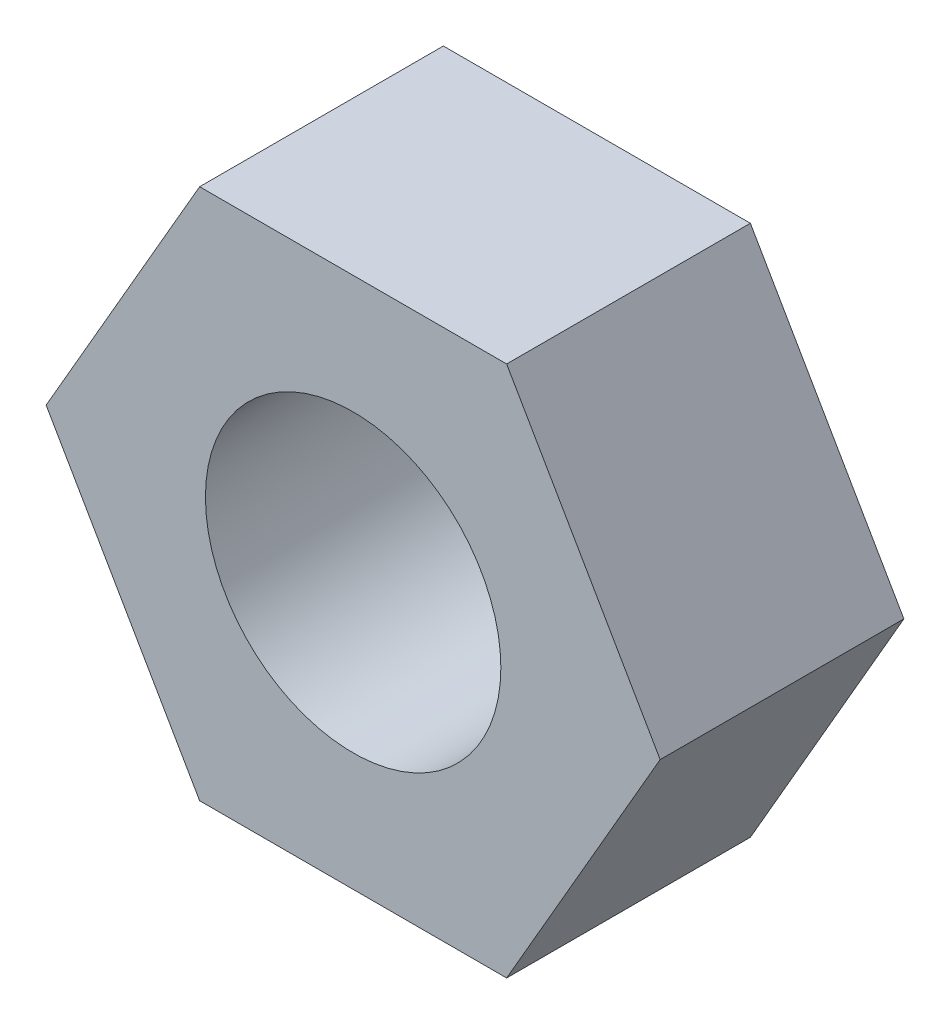
ISO-10303-21;
HEADER;
FILE_DESCRIPTION(('STEP AP214'),'2;1');
FILE_NAME('part.step','',(''),(''),'','','');
FILE_SCHEMA(('AUTOMOTIVE_DESIGN { 1 0 10303 214 1 1 1 1 }'));
ENDSEC;
DATA;
#1=APPLICATION_CONTEXT('core data for automotive mechanical design processes');
#2=APPLICATION_PROTOCOL_DEFINITION('international standard','automotive_design',2000,#1);
#3=PRODUCT_CONTEXT('',#1,'mechanical');
#4=PRODUCT('Part','Part','',(#3));
#5=PRODUCT_RELATED_PRODUCT_CATEGORY('part','',(#4));
#6=PRODUCT_DEFINITION_FORMATION('','',#4);
#7=PRODUCT_DEFINITION_CONTEXT('part definition',#1,'design');
#8=PRODUCT_DEFINITION('design','',#6,#7);
#9=PRODUCT_DEFINITION_SHAPE('','',#8);
#10=(LENGTH_UNIT() NAMED_UNIT(*) SI_UNIT(.MILLI.,.METRE.));
#11=(NAMED_UNIT(*) PLANE_ANGLE_UNIT() SI_UNIT($,.RADIAN.));
#12=(NAMED_UNIT(*) SI_UNIT($,.STERADIAN.) SOLID_ANGLE_UNIT());
#13=UNCERTAINTY_MEASURE_WITH_UNIT(LENGTH_MEASURE(1.E-05),#10,'distance_accuracy_value','');
#14=(GEOMETRIC_REPRESENTATION_CONTEXT(3) GLOBAL_UNCERTAINTY_ASSIGNED_CONTEXT((#13)) GLOBAL_UNIT_ASSIGNED_CONTEXT((#10,
#11,#12)) REPRESENTATION_CONTEXT('',''));
#15=CARTESIAN_POINT('',(0.,0.,0.));
#16=DIRECTION('',(0.,0.,1.));
#17=DIRECTION('',(1.,0.,0.));
#18=AXIS2_PLACEMENT_3D('',#15,#16,#17);
#19=CARTESIAN_POINT('',(0.,0.,3.3));
#20=DIRECTION('',(0.,0.,1.));
#21=DIRECTION('',(1.,0.,0.));
#22=AXIS2_PLACEMENT_3D('',#19,#20,#21);
#23=PLANE('',#22);
#24=DIRECTION('',(0.5,0.866025403784439,0.));
#25=VECTOR('',#24,1.);
#26=CARTESIAN_POINT('',(2.07846096908265,-3.60000000000001,3.3));
#27=LINE('',#26,#25);
#28=CARTESIAN_POINT('',(2.07846096908265,-3.60000000000001,3.3));
#29=VERTEX_POINT('',#28);
#30=CARTESIAN_POINT('',(4.15692193816531,0.,3.3));
#31=VERTEX_POINT('',#30);
#32=EDGE_CURVE('E129',#29,#31,#27,.T.);
#33=ORIENTED_EDGE('',*,*,#32,.T.);
#34=DIRECTION('',(-0.5,0.866025403784439,0.));
#35=VECTOR('',#34,1.);
#36=CARTESIAN_POINT('',(4.15692193816531,0.,3.3));
#37=LINE('',#36,#35);
#38=CARTESIAN_POINT('',(2.07846096908264,3.60000000000001,3.3));
#39=VERTEX_POINT('',#38);
#40=EDGE_CURVE('E87',#31,#39,#37,.T.);
#41=ORIENTED_EDGE('',*,*,#40,.T.);
#42=DIRECTION('',(-1.,0.,0.));
#43=VECTOR('',#42,1.);
#44=CARTESIAN_POINT('',(2.07846096908264,3.60000000000001,3.3));
#45=LINE('',#44,#43);
#46=CARTESIAN_POINT('',(-2.07846096908265,3.60000000000001,3.3));
#47=VERTEX_POINT('',#46);
#48=EDGE_CURVE('E100',#39,#47,#45,.T.);
#49=ORIENTED_EDGE('',*,*,#48,.T.);
#50=DIRECTION('',(-0.499999999999999,-0.866025403784439,0.));
#51=VECTOR('',#50,1.);
#52=CARTESIAN_POINT('',(-2.07846096908265,3.60000000000001,3.3));
#53=LINE('',#52,#51);
#54=CARTESIAN_POINT('',(-4.15692193816531,0.,3.3));
#55=VERTEX_POINT('',#54);
#56=EDGE_CURVE('E94',#47,#55,#53,.T.);
#57=ORIENTED_EDGE('',*,*,#56,.T.);
#58=DIRECTION('',(0.5,-0.866025403784438,0.));
#59=VECTOR('',#58,1.);
#60=CARTESIAN_POINT('',(-4.15692193816531,0.,3.3));
#61=LINE('',#60,#59);
#62=CARTESIAN_POINT('',(-2.07846096908265,-3.60000000000001,3.3));
#63=VERTEX_POINT('',#62);
#64=EDGE_CURVE('E98',#55,#63,#61,.T.);
#65=ORIENTED_EDGE('',*,*,#64,.T.);
#66=DIRECTION('',(1.,0.,0.));
#67=VECTOR('',#66,1.);
#68=CARTESIAN_POINT('',(-2.07846096908265,-3.60000000000001,3.3));
#69=LINE('',#68,#67);
#70=EDGE_CURVE('E50',#63,#29,#69,.T.);
#71=ORIENTED_EDGE('',*,*,#70,.T.);
#72=EDGE_LOOP('',(#33,#41,#49,#57,#65,#71));
#73=FACE_BOUND('',#72,.T.);
#74=CARTESIAN_POINT('',(0.,0.,3.3));
#75=DIRECTION('',(0.,0.,1.));
#76=DIRECTION('',(1.,0.,0.));
#77=AXIS2_PLACEMENT_3D('',#74,#75,#76);
#78=CIRCLE('',#77,2.);
#79=CARTESIAN_POINT('',(2.,0.,3.3));
#80=VERTEX_POINT('',#79);
#81=EDGE_CURVE('E122',#80,#80,#78,.T.);
#82=ORIENTED_EDGE('',*,*,#81,.F.);
#83=EDGE_LOOP('',(#82));
#84=FACE_BOUND('',#83,.T.);
#85=ADVANCED_FACE('F33',(#73,#84),#23,.T.);
#86=CARTESIAN_POINT('',(0.,0.,0.));
#87=DIRECTION('',(0.,0.,1.));
#88=DIRECTION('',(1.,0.,0.));
#89=AXIS2_PLACEMENT_3D('',#86,#87,#88);
#90=PLANE('',#89);
#91=DIRECTION('',(0.5,0.866025403784439,0.));
#92=VECTOR('',#91,1.);
#93=CARTESIAN_POINT('',(2.07846096908265,-3.60000000000001,0.));
#94=LINE('',#93,#92);
#95=CARTESIAN_POINT('',(2.07846096908265,-3.60000000000001,0.));
#96=VERTEX_POINT('',#95);
#97=CARTESIAN_POINT('',(4.15692193816531,0.,0.));
#98=VERTEX_POINT('',#97);
#99=EDGE_CURVE('E118',#96,#98,#94,.T.);
#100=ORIENTED_EDGE('',*,*,#99,.F.);
#101=DIRECTION('',(1.,0.,0.));
#102=VECTOR('',#101,1.);
#103=CARTESIAN_POINT('',(-2.07846096908265,-3.60000000000001,0.));
#104=LINE('',#103,#102);
#105=CARTESIAN_POINT('',(-2.07846096908265,-3.60000000000001,0.));
#106=VERTEX_POINT('',#105);
#107=EDGE_CURVE('E79',#106,#96,#104,.T.);
#108=ORIENTED_EDGE('',*,*,#107,.F.);
#109=DIRECTION('',(0.5,-0.866025403784438,0.));
#110=VECTOR('',#109,1.);
#111=CARTESIAN_POINT('',(-4.15692193816531,0.,0.));
#112=LINE('',#111,#110);
#113=CARTESIAN_POINT('',(-4.15692193816531,0.,0.));
#114=VERTEX_POINT('',#113);
#115=EDGE_CURVE('E73',#114,#106,#112,.T.);
#116=ORIENTED_EDGE('',*,*,#115,.F.);
#117=DIRECTION('',(-0.499999999999999,-0.866025403784439,0.));
#118=VECTOR('',#117,1.);
#119=CARTESIAN_POINT('',(-2.07846096908265,3.60000000000001,0.));
#120=LINE('',#119,#118);
#121=CARTESIAN_POINT('',(-2.07846096908265,3.60000000000001,0.));
#122=VERTEX_POINT('',#121);
#123=EDGE_CURVE('E108',#122,#114,#120,.T.);
#124=ORIENTED_EDGE('',*,*,#123,.F.);
#125=DIRECTION('',(-1.,0.,0.));
#126=VECTOR('',#125,1.);
#127=CARTESIAN_POINT('',(2.07846096908264,3.60000000000001,0.));
#128=LINE('',#127,#126);
#129=CARTESIAN_POINT('',(2.07846096908264,3.60000000000001,0.));
#130=VERTEX_POINT('',#129);
#131=EDGE_CURVE('E124',#130,#122,#128,.T.);
#132=ORIENTED_EDGE('',*,*,#131,.F.);
#133=DIRECTION('',(-0.5,0.866025403784439,0.));
#134=VECTOR('',#133,1.);
#135=CARTESIAN_POINT('',(4.15692193816531,0.,0.));
#136=LINE('',#135,#134);
#137=EDGE_CURVE('E121',#98,#130,#136,.T.);
#138=ORIENTED_EDGE('',*,*,#137,.F.);
#139=EDGE_LOOP('',(#100,#108,#116,#124,#132,#138));
#140=FACE_BOUND('',#139,.T.);
#141=CARTESIAN_POINT('',(0.,0.,0.));
#142=DIRECTION('',(0.,0.,1.));
#143=DIRECTION('',(1.,0.,0.));
#144=AXIS2_PLACEMENT_3D('',#141,#142,#143);
#145=CIRCLE('',#144,2.);
#146=CARTESIAN_POINT('',(2.,0.,0.));
#147=VERTEX_POINT('',#146);
#148=EDGE_CURVE('E222',#147,#147,#145,.T.);
#149=ORIENTED_EDGE('',*,*,#148,.T.);
#150=EDGE_LOOP('',(#149));
#151=FACE_BOUND('',#150,.T.);
#152=ADVANCED_FACE('F138',(#140,#151),#90,.F.);
#153=CARTESIAN_POINT('',(2.07846096908265,-3.60000000000001,3.3));
#154=DIRECTION('',(-0.866025403784439,0.5,0.));
#155=DIRECTION('',(-0.5,-0.866025403784439,0.));
#156=AXIS2_PLACEMENT_3D('',#153,#154,#155);
#157=PLANE('',#156);
#158=ORIENTED_EDGE('',*,*,#99,.T.);
#159=DIRECTION('',(0.,0.,-1.));
#160=VECTOR('',#159,1.);
#161=CARTESIAN_POINT('',(4.15692193816531,0.,3.3));
#162=LINE('',#161,#160);
#163=EDGE_CURVE('E11',#31,#98,#162,.T.);
#164=ORIENTED_EDGE('',*,*,#163,.F.);
#165=ORIENTED_EDGE('',*,*,#32,.F.);
#166=DIRECTION('',(0.,0.,-1.));
#167=VECTOR('',#166,1.);
#168=CARTESIAN_POINT('',(2.07846096908265,-3.60000000000001,3.3));
#169=LINE('',#168,#167);
#170=EDGE_CURVE('E114',#29,#96,#169,.T.);
#171=ORIENTED_EDGE('',*,*,#170,.T.);
#172=EDGE_LOOP('',(#158,#164,#165,#171));
#173=FACE_BOUND('',#172,.T.);
#174=ADVANCED_FACE('F35',(#173),#157,.F.);
#175=CARTESIAN_POINT('',(4.15692193816531,0.,3.3));
#176=DIRECTION('',(-0.866025403784439,-0.5,0.));
#177=DIRECTION('',(0.5,-0.866025403784439,0.));
#178=AXIS2_PLACEMENT_3D('',#175,#176,#177);
#179=PLANE('',#178);
#180=ORIENTED_EDGE('',*,*,#137,.T.);
#181=DIRECTION('',(0.,0.,-1.));
#182=VECTOR('',#181,1.);
#183=CARTESIAN_POINT('',(2.07846096908264,3.60000000000001,3.3));
#184=LINE('',#183,#182);
#185=EDGE_CURVE('E42',#39,#130,#184,.T.);
#186=ORIENTED_EDGE('',*,*,#185,.F.);
#187=ORIENTED_EDGE('',*,*,#40,.F.);
#188=ORIENTED_EDGE('',*,*,#163,.T.);
#189=EDGE_LOOP('',(#180,#186,#187,#188));
#190=FACE_BOUND('',#189,.T.);
#191=ADVANCED_FACE('F163',(#190),#179,.F.);
#192=CARTESIAN_POINT('',(2.07846096908264,3.60000000000001,3.3));
#193=DIRECTION('',(0.,-1.,0.));
#194=DIRECTION('',(0.,0.,-1.));
#195=AXIS2_PLACEMENT_3D('',#192,#193,#194);
#196=PLANE('',#195);
#197=ORIENTED_EDGE('',*,*,#131,.T.);
#198=DIRECTION('',(0.,0.,-1.));
#199=VECTOR('',#198,1.);
#200=CARTESIAN_POINT('',(-2.07846096908265,3.60000000000001,3.3));
#201=LINE('',#200,#199);
#202=EDGE_CURVE('E109',#47,#122,#201,.T.);
#203=ORIENTED_EDGE('',*,*,#202,.F.);
#204=ORIENTED_EDGE('',*,*,#48,.F.);
#205=ORIENTED_EDGE('',*,*,#185,.T.);
#206=EDGE_LOOP('',(#197,#203,#204,#205));
#207=FACE_BOUND('',#206,.T.);
#208=ADVANCED_FACE('F135',(#207),#196,.F.);
#209=CARTESIAN_POINT('',(-2.07846096908265,3.60000000000001,3.3));
#210=DIRECTION('',(0.866025403784439,-0.499999999999999,0.));
#211=DIRECTION('',(0.499999999999999,0.866025403784439,0.));
#212=AXIS2_PLACEMENT_3D('',#209,#210,#211);
#213=PLANE('',#212);
#214=ORIENTED_EDGE('',*,*,#123,.T.);
#215=DIRECTION('',(0.,0.,-1.));
#216=VECTOR('',#215,1.);
#217=CARTESIAN_POINT('',(-4.15692193816531,0.,3.3));
#218=LINE('',#217,#216);
#219=EDGE_CURVE('E105',#55,#114,#218,.T.);
#220=ORIENTED_EDGE('',*,*,#219,.F.);
#221=ORIENTED_EDGE('',*,*,#56,.F.);
#222=ORIENTED_EDGE('',*,*,#202,.T.);
#223=EDGE_LOOP('',(#214,#220,#221,#222));
#224=FACE_BOUND('',#223,.T.);
#225=ADVANCED_FACE('F106',(#224),#213,.F.);
#226=CARTESIAN_POINT('',(-4.15692193816531,0.,3.3));
#227=DIRECTION('',(0.866025403784438,0.500000000000001,0.));
#228=DIRECTION('',(-0.500000000000001,0.866025403784438,0.));
#229=AXIS2_PLACEMENT_3D('',#226,#227,#228);
#230=PLANE('',#229);
#231=ORIENTED_EDGE('',*,*,#115,.T.);
#232=DIRECTION('',(0.,0.,-1.));
#233=VECTOR('',#232,1.);
#234=CARTESIAN_POINT('',(-2.07846096908265,-3.60000000000001,3.3));
#235=LINE('',#234,#233);
#236=EDGE_CURVE('E110',#63,#106,#235,.T.);
#237=ORIENTED_EDGE('',*,*,#236,.F.);
#238=ORIENTED_EDGE('',*,*,#64,.F.);
#239=ORIENTED_EDGE('',*,*,#219,.T.);
#240=EDGE_LOOP('',(#231,#237,#238,#239));
#241=FACE_BOUND('',#240,.T.);
#242=ADVANCED_FACE('F112',(#241),#230,.F.);
#243=CARTESIAN_POINT('',(-2.07846096908265,-3.60000000000001,3.3));
#244=DIRECTION('',(0.,1.,0.));
#245=DIRECTION('',(0.,0.,1.));
#246=AXIS2_PLACEMENT_3D('',#243,#244,#245);
#247=PLANE('',#246);
#248=ORIENTED_EDGE('',*,*,#107,.T.);
#249=ORIENTED_EDGE('',*,*,#170,.F.);
#250=ORIENTED_EDGE('',*,*,#70,.F.);
#251=ORIENTED_EDGE('',*,*,#236,.T.);
#252=EDGE_LOOP('',(#248,#249,#250,#251));
#253=FACE_BOUND('',#252,.T.);
#254=ADVANCED_FACE('F143',(#253),#247,.F.);
#255=CARTESIAN_POINT('',(0.,0.,3.3));
#256=DIRECTION('',(0.,0.,-1.));
#257=DIRECTION('',(-1.,0.,0.));
#258=AXIS2_PLACEMENT_3D('',#255,#256,#257);
#259=CYLINDRICAL_SURFACE('',#258,2.);
#260=ORIENTED_EDGE('',*,*,#81,.T.);
#261=EDGE_LOOP('',(#260));
#262=FACE_BOUND('',#261,.T.);
#263=ORIENTED_EDGE('',*,*,#148,.F.);
#264=EDGE_LOOP('',(#263));
#265=FACE_BOUND('',#264,.T.);
#266=ADVANCED_FACE('F145',(#262,#265),#259,.F.);
#267=CLOSED_SHELL('',(#85,#152,#174,#191,#208,#225,#242,#254,#266));
#268=MANIFOLD_SOLID_BREP('B2',#267);
#269=ADVANCED_BREP_SHAPE_REPRESENTATION('',(#18,#268),#14);
#270=SHAPE_DEFINITION_REPRESENTATION(#9,#269);
ENDSEC;
END-ISO-10303-21;
